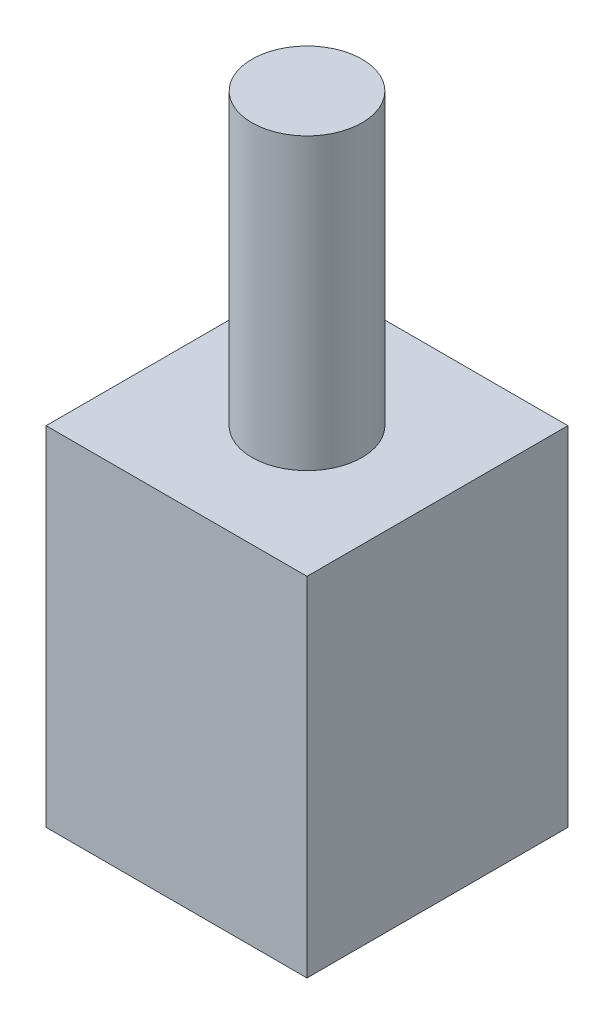
ISO-10303-21;
HEADER;
FILE_DESCRIPTION(('STEP AP214'),'2;1');
FILE_NAME('part.step','',(''),(''),'','','');
FILE_SCHEMA(('AUTOMOTIVE_DESIGN { 1 0 10303 214 1 1 1 1 }'));
ENDSEC;
DATA;
#1=APPLICATION_CONTEXT('core data for automotive mechanical design processes');
#2=APPLICATION_PROTOCOL_DEFINITION('international standard','automotive_design',2000,#1);
#3=PRODUCT_CONTEXT('',#1,'mechanical');
#4=PRODUCT('Part','Part','',(#3));
#5=PRODUCT_RELATED_PRODUCT_CATEGORY('part','',(#4));
#6=PRODUCT_DEFINITION_FORMATION('','',#4);
#7=PRODUCT_DEFINITION_CONTEXT('part definition',#1,'design');
#8=PRODUCT_DEFINITION('design','',#6,#7);
#9=PRODUCT_DEFINITION_SHAPE('','',#8);
#10=(LENGTH_UNIT() NAMED_UNIT(*) SI_UNIT(.MILLI.,.METRE.));
#11=(NAMED_UNIT(*) PLANE_ANGLE_UNIT() SI_UNIT($,.RADIAN.));
#12=(NAMED_UNIT(*) SI_UNIT($,.STERADIAN.) SOLID_ANGLE_UNIT());
#13=UNCERTAINTY_MEASURE_WITH_UNIT(LENGTH_MEASURE(1.E-05),#10,'distance_accuracy_value','');
#14=(GEOMETRIC_REPRESENTATION_CONTEXT(3) GLOBAL_UNCERTAINTY_ASSIGNED_CONTEXT((#13)) GLOBAL_UNIT_ASSIGNED_CONTEXT((#10,
#11,#12)) REPRESENTATION_CONTEXT('',''));
#15=CARTESIAN_POINT('',(0.,0.,0.));
#16=DIRECTION('',(0.,0.,1.));
#17=DIRECTION('',(1.,0.,0.));
#18=AXIS2_PLACEMENT_3D('',#15,#16,#17);
#19=CARTESIAN_POINT('',(-3.82191780821919,12.,-4.13013698630137));
#20=DIRECTION('',(1.,0.,0.));
#21=DIRECTION('',(0.,0.,-1.));
#22=AXIS2_PLACEMENT_3D('',#19,#20,#21);
#23=PLANE('',#22);
#24=DIRECTION('',(0.,0.,1.));
#25=VECTOR('',#24,1.);
#26=CARTESIAN_POINT('',(-3.82191780821919,0.,-4.13013698630137));
#27=LINE('',#26,#25);
#28=CARTESIAN_POINT('',(-3.82191780821919,0.,-4.13013698630137));
#29=VERTEX_POINT('',#28);
#30=CARTESIAN_POINT('',(-3.82191780821919,0.,4.86986301369863));
#31=VERTEX_POINT('',#30);
#32=EDGE_CURVE('E110',#29,#31,#27,.T.);
#33=ORIENTED_EDGE('',*,*,#32,.T.);
#34=DIRECTION('',(0.,-1.,0.));
#35=VECTOR('',#34,1.);
#36=CARTESIAN_POINT('',(-3.82191780821919,12.,4.86986301369863));
#37=LINE('',#36,#35);
#38=CARTESIAN_POINT('',(-3.82191780821919,12.,4.86986301369863));
#39=VERTEX_POINT('',#38);
#40=EDGE_CURVE('E42',#39,#31,#37,.T.);
#41=ORIENTED_EDGE('',*,*,#40,.F.);
#42=DIRECTION('',(0.,0.,1.));
#43=VECTOR('',#42,1.);
#44=CARTESIAN_POINT('',(-3.82191780821919,12.,-4.13013698630137));
#45=LINE('',#44,#43);
#46=CARTESIAN_POINT('',(-3.82191780821919,12.,-4.13013698630137));
#47=VERTEX_POINT('',#46);
#48=EDGE_CURVE('E93',#47,#39,#45,.T.);
#49=ORIENTED_EDGE('',*,*,#48,.F.);
#50=DIRECTION('',(0.,-1.,0.));
#51=VECTOR('',#50,1.);
#52=CARTESIAN_POINT('',(-3.82191780821919,12.,-4.13013698630137));
#53=LINE('',#52,#51);
#54=EDGE_CURVE('E106',#47,#29,#53,.T.);
#55=ORIENTED_EDGE('',*,*,#54,.T.);
#56=EDGE_LOOP('',(#33,#41,#49,#55));
#57=FACE_BOUND('',#56,.T.);
#58=ADVANCED_FACE('F39',(#57),#23,.F.);
#59=CARTESIAN_POINT('',(-3.82191780821919,12.,4.86986301369863));
#60=DIRECTION('',(0.,0.,-1.));
#61=DIRECTION('',(-1.,0.,0.));
#62=AXIS2_PLACEMENT_3D('',#59,#60,#61);
#63=PLANE('',#62);
#64=DIRECTION('',(1.,0.,0.));
#65=VECTOR('',#64,1.);
#66=CARTESIAN_POINT('',(-3.82191780821919,0.,4.86986301369863));
#67=LINE('',#66,#65);
#68=CARTESIAN_POINT('',(5.17808219178081,0.,4.86986301369863));
#69=VERTEX_POINT('',#68);
#70=EDGE_CURVE('E99',#31,#69,#67,.T.);
#71=ORIENTED_EDGE('',*,*,#70,.T.);
#72=DIRECTION('',(0.,-1.,0.));
#73=VECTOR('',#72,1.);
#74=CARTESIAN_POINT('',(5.17808219178081,12.,4.86986301369863));
#75=LINE('',#74,#73);
#76=CARTESIAN_POINT('',(5.17808219178081,12.,4.86986301369863));
#77=VERTEX_POINT('',#76);
#78=EDGE_CURVE('E97',#77,#69,#75,.T.);
#79=ORIENTED_EDGE('',*,*,#78,.F.);
#80=DIRECTION('',(1.,0.,0.));
#81=VECTOR('',#80,1.);
#82=CARTESIAN_POINT('',(-3.82191780821919,12.,4.86986301369863));
#83=LINE('',#82,#81);
#84=EDGE_CURVE('E88',#39,#77,#83,.T.);
#85=ORIENTED_EDGE('',*,*,#84,.F.);
#86=ORIENTED_EDGE('',*,*,#40,.T.);
#87=EDGE_LOOP('',(#71,#79,#85,#86));
#88=FACE_BOUND('',#87,.T.);
#89=ADVANCED_FACE('F98',(#88),#63,.F.);
#90=CARTESIAN_POINT('',(5.17808219178081,12.,-4.13013698630137));
#91=DIRECTION('',(-1.,0.,0.));
#92=DIRECTION('',(0.,0.,1.));
#93=AXIS2_PLACEMENT_3D('',#90,#91,#92);
#94=PLANE('',#93);
#95=DIRECTION('',(0.,0.,-1.));
#96=VECTOR('',#95,1.);
#97=CARTESIAN_POINT('',(5.17808219178081,0.,-4.13013698630137));
#98=LINE('',#97,#96);
#99=CARTESIAN_POINT('',(5.17808219178081,0.,-4.13013698630137));
#100=VERTEX_POINT('',#99);
#101=EDGE_CURVE('E74',#69,#100,#98,.T.);
#102=ORIENTED_EDGE('',*,*,#101,.T.);
#103=DIRECTION('',(0.,-1.,0.));
#104=VECTOR('',#103,1.);
#105=CARTESIAN_POINT('',(5.17808219178081,12.,-4.13013698630137));
#106=LINE('',#105,#104);
#107=CARTESIAN_POINT('',(5.17808219178081,12.,-4.13013698630137));
#108=VERTEX_POINT('',#107);
#109=EDGE_CURVE('E101',#108,#100,#106,.T.);
#110=ORIENTED_EDGE('',*,*,#109,.F.);
#111=DIRECTION('',(0.,0.,-1.));
#112=VECTOR('',#111,1.);
#113=CARTESIAN_POINT('',(5.17808219178081,12.,-4.13013698630137));
#114=LINE('',#113,#112);
#115=EDGE_CURVE('E91',#77,#108,#114,.T.);
#116=ORIENTED_EDGE('',*,*,#115,.F.);
#117=ORIENTED_EDGE('',*,*,#78,.T.);
#118=EDGE_LOOP('',(#102,#110,#116,#117));
#119=FACE_BOUND('',#118,.T.);
#120=ADVANCED_FACE('F102',(#119),#94,.F.);
#121=CARTESIAN_POINT('',(-3.82191780821919,12.,-4.13013698630137));
#122=DIRECTION('',(0.,0.,1.));
#123=DIRECTION('',(1.,0.,0.));
#124=AXIS2_PLACEMENT_3D('',#121,#122,#123);
#125=PLANE('',#124);
#126=DIRECTION('',(-1.,0.,0.));
#127=VECTOR('',#126,1.);
#128=CARTESIAN_POINT('',(-3.82191780821919,0.,-4.13013698630137));
#129=LINE('',#128,#127);
#130=EDGE_CURVE('E80',#100,#29,#129,.T.);
#131=ORIENTED_EDGE('',*,*,#130,.T.);
#132=ORIENTED_EDGE('',*,*,#54,.F.);
#133=DIRECTION('',(-1.,0.,0.));
#134=VECTOR('',#133,1.);
#135=CARTESIAN_POINT('',(-3.82191780821919,12.,-4.13013698630137));
#136=LINE('',#135,#134);
#137=EDGE_CURVE('E57',#108,#47,#136,.T.);
#138=ORIENTED_EDGE('',*,*,#137,.F.);
#139=ORIENTED_EDGE('',*,*,#109,.T.);
#140=EDGE_LOOP('',(#131,#132,#138,#139));
#141=FACE_BOUND('',#140,.T.);
#142=ADVANCED_FACE('F124',(#141),#125,.F.);
#143=CARTESIAN_POINT('',(0.,12.,0.));
#144=DIRECTION('',(0.,1.,0.));
#145=DIRECTION('',(0.,0.,1.));
#146=AXIS2_PLACEMENT_3D('',#143,#144,#145);
#147=PLANE('',#146);
#148=CARTESIAN_POINT('',(0.678082191780809,12.,0.369863013698633));
#149=DIRECTION('',(0.,1.,0.));
#150=DIRECTION('',(0.,0.,1.));
#151=AXIS2_PLACEMENT_3D('',#148,#149,#150);
#152=CIRCLE('',#151,1.9);
#153=CARTESIAN_POINT('',(0.678082191780809,12.,2.26986301369863));
#154=VERTEX_POINT('',#153);
#155=EDGE_CURVE('E11',#154,#154,#152,.T.);
#156=ORIENTED_EDGE('',*,*,#155,.F.);
#157=EDGE_LOOP('',(#156));
#158=FACE_BOUND('',#157,.T.);
#159=ORIENTED_EDGE('',*,*,#48,.T.);
#160=ORIENTED_EDGE('',*,*,#84,.T.);
#161=ORIENTED_EDGE('',*,*,#115,.T.);
#162=ORIENTED_EDGE('',*,*,#137,.T.);
#163=EDGE_LOOP('',(#159,#160,#161,#162));
#164=FACE_BOUND('',#163,.T.);
#165=ADVANCED_FACE('F89',(#158,#164),#147,.T.);
#166=CARTESIAN_POINT('',(0.,0.,0.));
#167=DIRECTION('',(0.,1.,0.));
#168=DIRECTION('',(0.,0.,1.));
#169=AXIS2_PLACEMENT_3D('',#166,#167,#168);
#170=PLANE('',#169);
#171=ORIENTED_EDGE('',*,*,#32,.F.);
#172=ORIENTED_EDGE('',*,*,#130,.F.);
#173=ORIENTED_EDGE('',*,*,#101,.F.);
#174=ORIENTED_EDGE('',*,*,#70,.F.);
#175=EDGE_LOOP('',(#171,#172,#173,#174));
#176=FACE_BOUND('',#175,.T.);
#177=ADVANCED_FACE('F127',(#176),#170,.F.);
#178=CARTESIAN_POINT('',(0.678082191780809,22.,0.369863013698633));
#179=DIRECTION('',(0.,-1.,0.));
#180=DIRECTION('',(0.,0.,-1.));
#181=AXIS2_PLACEMENT_3D('',#178,#179,#180);
#182=CYLINDRICAL_SURFACE('',#181,1.9);
#183=CARTESIAN_POINT('',(0.678082191780809,22.,0.369863013698633));
#184=DIRECTION('',(0.,1.,0.));
#185=DIRECTION('',(0.,0.,1.));
#186=AXIS2_PLACEMENT_3D('',#183,#184,#185);
#187=CIRCLE('',#186,1.9);
#188=CARTESIAN_POINT('',(0.678082191780809,22.,2.26986301369863));
#189=VERTEX_POINT('',#188);
#190=EDGE_CURVE('E114',#189,#189,#187,.T.);
#191=ORIENTED_EDGE('',*,*,#190,.F.);
#192=EDGE_LOOP('',(#191));
#193=FACE_BOUND('',#192,.T.);
#194=ORIENTED_EDGE('',*,*,#155,.T.);
#195=EDGE_LOOP('',(#194));
#196=FACE_BOUND('',#195,.T.);
#197=ADVANCED_FACE('F137',(#193,#196),#182,.T.);
#198=CARTESIAN_POINT('',(0.678082191780809,22.,0.369863013698633));
#199=DIRECTION('',(0.,1.,0.));
#200=DIRECTION('',(0.,0.,1.));
#201=AXIS2_PLACEMENT_3D('',#198,#199,#200);
#202=PLANE('',#201);
#203=ORIENTED_EDGE('',*,*,#190,.T.);
#204=EDGE_LOOP('',(#203));
#205=FACE_BOUND('',#204,.T.);
#206=ADVANCED_FACE('F135',(#205),#202,.T.);
#207=CLOSED_SHELL('',(#58,#89,#120,#142,#165,#177,#197,#206));
#208=MANIFOLD_SOLID_BREP('B2',#207);
#209=ADVANCED_BREP_SHAPE_REPRESENTATION('',(#18,#208),#14);
#210=SHAPE_DEFINITION_REPRESENTATION(#9,#209);
ENDSEC;
END-ISO-10303-21;
